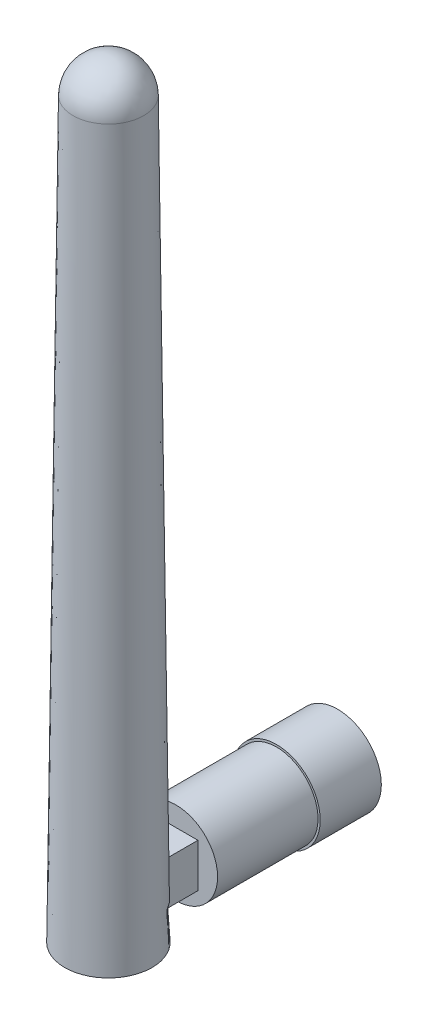
ISO-10303-21;
HEADER;
FILE_DESCRIPTION(('STEP AP214'),'2;1');
FILE_NAME('part.step','',(''),(''),'','','');
FILE_SCHEMA(('AUTOMOTIVE_DESIGN { 1 0 10303 214 1 1 1 1 }'));
ENDSEC;
DATA;
#1=APPLICATION_CONTEXT('core data for automotive mechanical design processes');
#2=APPLICATION_PROTOCOL_DEFINITION('international standard','automotive_design',2000,#1);
#3=PRODUCT_CONTEXT('',#1,'mechanical');
#4=PRODUCT('Part','Part','',(#3));
#5=PRODUCT_RELATED_PRODUCT_CATEGORY('part','',(#4));
#6=PRODUCT_DEFINITION_FORMATION('','',#4);
#7=PRODUCT_DEFINITION_CONTEXT('part definition',#1,'design');
#8=PRODUCT_DEFINITION('design','',#6,#7);
#9=PRODUCT_DEFINITION_SHAPE('','',#8);
#10=(LENGTH_UNIT() NAMED_UNIT(*) SI_UNIT(.MILLI.,.METRE.));
#11=(NAMED_UNIT(*) PLANE_ANGLE_UNIT() SI_UNIT($,.RADIAN.));
#12=(NAMED_UNIT(*) SI_UNIT($,.STERADIAN.) SOLID_ANGLE_UNIT());
#13=UNCERTAINTY_MEASURE_WITH_UNIT(LENGTH_MEASURE(1.E-05),#10,'distance_accuracy_value','');
#14=(GEOMETRIC_REPRESENTATION_CONTEXT(3) GLOBAL_UNCERTAINTY_ASSIGNED_CONTEXT((#13)) GLOBAL_UNIT_ASSIGNED_CONTEXT((#10,
#11,#12)) REPRESENTATION_CONTEXT('',''));
#15=CARTESIAN_POINT('',(0.,0.,0.));
#16=DIRECTION('',(0.,0.,1.));
#17=DIRECTION('',(1.,0.,0.));
#18=AXIS2_PLACEMENT_3D('',#15,#16,#17);
#19=CARTESIAN_POINT('',(-2.5,-2.5,29.));
#20=DIRECTION('',(1.,0.,0.));
#21=DIRECTION('',(0.,0.,-1.));
#22=AXIS2_PLACEMENT_3D('',#19,#20,#21);
#23=PLANE('',#22);
#24=CARTESIAN_POINT('',(-2.5,11.7231333728484,22.1407716701814));
#25=CARTESIAN_POINT('',(-2.5,8.55279811187691,22.0986135463618));
#26=CARTESIAN_POINT('',(-2.5,5.38246076507635,22.0566136043882));
#27=CARTESIAN_POINT('',(-2.5,-2.43295909163195,21.9534666291546));
#28=CARTESIAN_POINT('',(-2.5,-7.07804399339697,21.8925009858276));
#29=CARTESIAN_POINT('',(-2.5,-11.7231333728484,21.8318749142798));
#30=B_SPLINE_CURVE_WITH_KNOTS('',3,(#24,#25,#26,#27,#28,#29),.UNSPECIFIED.,.F.,.F.,(4,2,4),(0.,
9.51184661297679,23.4483015061139),.UNSPECIFIED.);
#31=CARTESIAN_POINT('',(-2.5,2.50000000000003,22.0185710497848));
#32=VERTEX_POINT('',#31);
#33=CARTESIAN_POINT('',(-2.5,-2.5,21.9527082752802));
#34=VERTEX_POINT('',#33);
#35=EDGE_CURVE('E174',#32,#34,#30,.T.);
#36=ORIENTED_EDGE('',*,*,#35,.F.);
#37=DIRECTION('',(0.,0.,-1.));
#38=VECTOR('',#37,1.);
#39=CARTESIAN_POINT('',(-2.5,2.5,29.));
#40=LINE('',#39,#38);
#41=CARTESIAN_POINT('',(-2.5,2.5,18.5));
#42=VERTEX_POINT('',#41);
#43=EDGE_CURVE('E200',#32,#42,#40,.T.);
#44=ORIENTED_EDGE('',*,*,#43,.T.);
#45=DIRECTION('',(0.,-1.,0.));
#46=VECTOR('',#45,1.);
#47=CARTESIAN_POINT('',(-2.5,-2.5,18.5));
#48=LINE('',#47,#46);
#49=CARTESIAN_POINT('',(-2.5,-2.5,18.5));
#50=VERTEX_POINT('',#49);
#51=EDGE_CURVE('E182',#42,#50,#48,.T.);
#52=ORIENTED_EDGE('',*,*,#51,.T.);
#53=DIRECTION('',(0.,0.,-1.));
#54=VECTOR('',#53,1.);
#55=CARTESIAN_POINT('',(-2.5,-2.5,29.));
#56=LINE('',#55,#54);
#57=EDGE_CURVE('E206',#34,#50,#56,.T.);
#58=ORIENTED_EDGE('',*,*,#57,.F.);
#59=EDGE_LOOP('',(#36,#44,#52,#58));
#60=FACE_BOUND('',#59,.T.);
#61=ADVANCED_FACE('F39',(#60),#23,.F.);
#62=CARTESIAN_POINT('',(2.5,-2.5,29.));
#63=DIRECTION('',(-1.,0.,0.));
#64=DIRECTION('',(0.,0.,1.));
#65=AXIS2_PLACEMENT_3D('',#62,#63,#64);
#66=PLANE('',#65);
#67=CARTESIAN_POINT('',(2.5,-11.7231333728484,21.8318749142797));
#68=CARTESIAN_POINT('',(2.5,-8.37717526376025,21.8755501126024));
#69=CARTESIAN_POINT('',(2.5,-5.03121944660668,21.9193993916369));
#70=CARTESIAN_POINT('',(2.5,2.78420459956527,22.0222284422381));
#71=CARTESIAN_POINT('',(2.5,7.25367103097728,22.0813447485042));
#72=CARTESIAN_POINT('',(2.5,11.7231333728484,22.1407716701814));
#73=B_SPLINE_CURVE_WITH_KNOTS('',3,(#67,#68,#69,#70,#71,#72),.UNSPECIFIED.,.F.,.F.,(4,2,4),(0.,
10.0387293920367,23.4483015057422),.UNSPECIFIED.);
#74=CARTESIAN_POINT('',(2.5,-2.5,21.95270827528));
#75=VERTEX_POINT('',#74);
#76=CARTESIAN_POINT('',(2.5,2.50000000000003,22.0185710497851));
#77=VERTEX_POINT('',#76);
#78=EDGE_CURVE('E183',#75,#77,#73,.T.);
#79=ORIENTED_EDGE('',*,*,#78,.F.);
#80=DIRECTION('',(0.,0.,-1.));
#81=VECTOR('',#80,1.);
#82=CARTESIAN_POINT('',(2.5,-2.5,29.));
#83=LINE('',#82,#81);
#84=CARTESIAN_POINT('',(2.5,-2.5,18.5));
#85=VERTEX_POINT('',#84);
#86=EDGE_CURVE('E204',#75,#85,#83,.T.);
#87=ORIENTED_EDGE('',*,*,#86,.T.);
#88=DIRECTION('',(0.,1.,0.));
#89=VECTOR('',#88,1.);
#90=CARTESIAN_POINT('',(2.5,-2.5,18.5));
#91=LINE('',#90,#89);
#92=CARTESIAN_POINT('',(2.5,2.5,18.5));
#93=VERTEX_POINT('',#92);
#94=EDGE_CURVE('E194',#85,#93,#91,.T.);
#95=ORIENTED_EDGE('',*,*,#94,.T.);
#96=DIRECTION('',(0.,0.,-1.));
#97=VECTOR('',#96,1.);
#98=CARTESIAN_POINT('',(2.5,2.5,29.));
#99=LINE('',#98,#97);
#100=EDGE_CURVE('E202',#77,#93,#99,.T.);
#101=ORIENTED_EDGE('',*,*,#100,.F.);
#102=EDGE_LOOP('',(#79,#87,#95,#101));
#103=FACE_BOUND('',#102,.T.);
#104=ADVANCED_FACE('F158',(#103),#66,.F.);
#105=CARTESIAN_POINT('',(0.,0.,7.));
#106=DIRECTION('',(0.,0.,-1.));
#107=DIRECTION('',(-1.,0.,0.));
#108=AXIS2_PLACEMENT_3D('',#105,#106,#107);
#109=CYLINDRICAL_SURFACE('',#108,5.);
#110=CARTESIAN_POINT('',(0.,0.,7.));
#111=DIRECTION('',(0.,0.,1.));
#112=DIRECTION('',(1.,0.,0.));
#113=AXIS2_PLACEMENT_3D('',#110,#111,#112);
#114=CIRCLE('',#113,5.);
#115=CARTESIAN_POINT('',(5.,0.,7.));
#116=VERTEX_POINT('',#115);
#117=EDGE_CURVE('E215',#116,#116,#114,.T.);
#118=ORIENTED_EDGE('',*,*,#117,.F.);
#119=EDGE_LOOP('',(#118));
#120=FACE_BOUND('',#119,.T.);
#121=CARTESIAN_POINT('',(0.,0.,0.));
#122=DIRECTION('',(0.,0.,1.));
#123=DIRECTION('',(1.,0.,0.));
#124=AXIS2_PLACEMENT_3D('',#121,#122,#123);
#125=CIRCLE('',#124,5.);
#126=CARTESIAN_POINT('',(5.,0.,0.));
#127=VERTEX_POINT('',#126);
#128=EDGE_CURVE('E211',#127,#127,#125,.T.);
#129=ORIENTED_EDGE('',*,*,#128,.T.);
#130=EDGE_LOOP('',(#129));
#131=FACE_BOUND('',#130,.T.);
#132=ADVANCED_FACE('F41',(#120,#131),#109,.T.);
#133=CARTESIAN_POINT('',(0.,0.,7.));
#134=DIRECTION('',(0.,0.,1.));
#135=DIRECTION('',(1.,0.,0.));
#136=AXIS2_PLACEMENT_3D('',#133,#134,#135);
#137=PLANE('',#136);
#138=CARTESIAN_POINT('',(0.,0.,7.));
#139=DIRECTION('',(0.,0.,1.));
#140=DIRECTION('',(1.,0.,0.));
#141=AXIS2_PLACEMENT_3D('',#138,#139,#140);
#142=CIRCLE('',#141,4.75);
#143=CARTESIAN_POINT('',(4.75,0.,7.));
#144=VERTEX_POINT('',#143);
#145=EDGE_CURVE('E212',#144,#144,#142,.T.);
#146=ORIENTED_EDGE('',*,*,#145,.F.);
#147=EDGE_LOOP('',(#146));
#148=FACE_BOUND('',#147,.T.);
#149=ORIENTED_EDGE('',*,*,#117,.T.);
#150=EDGE_LOOP('',(#149));
#151=FACE_BOUND('',#150,.T.);
#152=ADVANCED_FACE('F256',(#148,#151),#137,.T.);
#153=CARTESIAN_POINT('',(0.,0.,0.));
#154=DIRECTION('',(0.,0.,1.));
#155=DIRECTION('',(1.,0.,0.));
#156=AXIS2_PLACEMENT_3D('',#153,#154,#155);
#157=PLANE('',#156);
#158=ORIENTED_EDGE('',*,*,#128,.F.);
#159=EDGE_LOOP('',(#158));
#160=FACE_BOUND('',#159,.T.);
#161=ADVANCED_FACE('F251',(#160),#157,.F.);
#162=CARTESIAN_POINT('',(0.,0.,18.5));
#163=DIRECTION('',(0.,0.,-1.));
#164=DIRECTION('',(-1.,0.,0.));
#165=AXIS2_PLACEMENT_3D('',#162,#163,#164);
#166=CYLINDRICAL_SURFACE('',#165,4.75);
#167=CARTESIAN_POINT('',(0.,0.,18.5));
#168=DIRECTION('',(0.,0.,1.));
#169=DIRECTION('',(1.,0.,0.));
#170=AXIS2_PLACEMENT_3D('',#167,#168,#169);
#171=CIRCLE('',#170,4.75);
#172=CARTESIAN_POINT('',(4.75,0.,18.5));
#173=VERTEX_POINT('',#172);
#174=EDGE_CURVE('E208',#173,#173,#171,.T.);
#175=ORIENTED_EDGE('',*,*,#174,.F.);
#176=EDGE_LOOP('',(#175));
#177=FACE_BOUND('',#176,.T.);
#178=ORIENTED_EDGE('',*,*,#145,.T.);
#179=EDGE_LOOP('',(#178));
#180=FACE_BOUND('',#179,.T.);
#181=ADVANCED_FACE('F247',(#177,#180),#166,.T.);
#182=CARTESIAN_POINT('',(0.,0.,18.5));
#183=DIRECTION('',(0.,0.,1.));
#184=DIRECTION('',(1.,0.,0.));
#185=AXIS2_PLACEMENT_3D('',#182,#183,#184);
#186=PLANE('',#185);
#187=ORIENTED_EDGE('',*,*,#94,.F.);
#188=DIRECTION('',(1.,0.,0.));
#189=VECTOR('',#188,1.);
#190=CARTESIAN_POINT('',(-2.5,-2.5,18.5));
#191=LINE('',#190,#189);
#192=EDGE_CURVE('E191',#50,#85,#191,.T.);
#193=ORIENTED_EDGE('',*,*,#192,.F.);
#194=ORIENTED_EDGE('',*,*,#51,.F.);
#195=DIRECTION('',(-1.,0.,0.));
#196=VECTOR('',#195,1.);
#197=CARTESIAN_POINT('',(-2.5,2.5,18.5));
#198=LINE('',#197,#196);
#199=EDGE_CURVE('E197',#93,#42,#198,.T.);
#200=ORIENTED_EDGE('',*,*,#199,.F.);
#201=EDGE_LOOP('',(#187,#193,#194,#200));
#202=FACE_BOUND('',#201,.T.);
#203=ORIENTED_EDGE('',*,*,#174,.T.);
#204=EDGE_LOOP('',(#203));
#205=FACE_BOUND('',#204,.T.);
#206=ADVANCED_FACE('F171',(#202,#205),#186,.T.);
#207=CARTESIAN_POINT('',(-2.5,-2.5,29.));
#208=DIRECTION('',(0.,1.,0.));
#209=DIRECTION('',(0.,0.,1.));
#210=AXIS2_PLACEMENT_3D('',#207,#208,#209);
#211=PLANE('',#210);
#212=ORIENTED_EDGE('',*,*,#86,.F.);
#213=DIRECTION('',(0.,0.,1.));
#214=VECTOR('',#213,1.);
#215=CARTESIAN_POINT('',(2.5,-2.5,18.5));
#216=LINE('',#215,#214);
#217=CARTESIAN_POINT('',(2.5,-2.5,29.));
#218=VERTEX_POINT('',#217);
#219=EDGE_CURVE('E109',#75,#218,#216,.T.);
#220=ORIENTED_EDGE('',*,*,#219,.T.);
#221=DIRECTION('',(-1.,0.,0.));
#222=VECTOR('',#221,1.);
#223=CARTESIAN_POINT('',(-2.50000000000004,-2.5,29.));
#224=LINE('',#223,#222);
#225=CARTESIAN_POINT('',(-2.50000000000004,-2.5,29.));
#226=VERTEX_POINT('',#225);
#227=EDGE_CURVE('E108',#218,#226,#224,.T.);
#228=ORIENTED_EDGE('',*,*,#227,.T.);
#229=DIRECTION('',(0.,0.,-1.));
#230=VECTOR('',#229,1.);
#231=CARTESIAN_POINT('',(-2.5,-2.5,18.5));
#232=LINE('',#231,#230);
#233=EDGE_CURVE('E118',#226,#34,#232,.T.);
#234=ORIENTED_EDGE('',*,*,#233,.T.);
#235=ORIENTED_EDGE('',*,*,#57,.T.);
#236=ORIENTED_EDGE('',*,*,#192,.T.);
#237=EDGE_LOOP('',(#212,#220,#228,#234,#235,#236));
#238=FACE_BOUND('',#237,.T.);
#239=ADVANCED_FACE('F170',(#238),#211,.F.);
#240=CARTESIAN_POINT('',(-2.5,2.5,29.));
#241=DIRECTION('',(0.,-1.,0.));
#242=DIRECTION('',(0.,0.,-1.));
#243=AXIS2_PLACEMENT_3D('',#240,#241,#242);
#244=PLANE('',#243);
#245=CARTESIAN_POINT('',(-2.70990556737046E-13,2.50000000000003,26.2499999999997));
#246=DIRECTION('',(0.,-1.,0.));
#247=DIRECTION('',(0.,0.,-1.));
#248=AXIS2_PLACEMENT_3D('',#245,#246,#247);
#249=CIRCLE('',#248,4.91477272726987);
#250=EDGE_CURVE('E47',#77,#32,#249,.F.);
#251=ORIENTED_EDGE('',*,*,#250,.F.);
#252=ORIENTED_EDGE('',*,*,#100,.T.);
#253=ORIENTED_EDGE('',*,*,#199,.T.);
#254=ORIENTED_EDGE('',*,*,#43,.F.);
#255=EDGE_LOOP('',(#251,#252,#253,#254));
#256=FACE_BOUND('',#255,.T.);
#257=ADVANCED_FACE('F236',(#256),#244,.F.);
#258=CARTESIAN_POINT('',(-2.70990556737046E-13,79.000258239291,26.25));
#259=DIRECTION('',(0.,-1.,0.));
#260=DIRECTION('',(1.,0.,0.));
#261=AXIS2_PLACEMENT_3D('',#258,#259,#260);
#262=CONICAL_SURFACE('',#261,4.04545161088495,0.0113631472646742);
#263=CARTESIAN_POINT('',(-2.70990556737046E-13,79.000258239291,26.25));
#264=DIRECTION('',(0.,-1.,0.));
#265=DIRECTION('',(1.,0.,0.));
#266=AXIS2_PLACEMENT_3D('',#263,#264,#265);
#267=CIRCLE('',#266,4.04545161088495);
#268=CARTESIAN_POINT('',(4.04545161088468,79.000258239291,26.25));
#269=VERTEX_POINT('',#268);
#270=EDGE_CURVE('E223',#269,#269,#267,.T.);
#271=ORIENTED_EDGE('',*,*,#270,.T.);
#272=EDGE_LOOP('',(#271));
#273=FACE_BOUND('',#272,.T.);
#274=CARTESIAN_POINT('',(0.,-5.,26.25));
#275=DIRECTION('',(0.,-1.,0.));
#276=DIRECTION('',(1.,0.,0.));
#277=AXIS2_PLACEMENT_3D('',#274,#275,#276);
#278=CIRCLE('',#277,5.00000000000002);
#279=CARTESIAN_POINT('',(2.50000000000001,-4.99999999999998,21.9198729810778));
#280=VERTEX_POINT('',#279);
#281=CARTESIAN_POINT('',(-2.49999999999999,-5.,21.9198729810778));
#282=VERTEX_POINT('',#281);
#283=EDGE_CURVE('E225',#280,#282,#278,.T.);
#284=ORIENTED_EDGE('',*,*,#283,.F.);
#285=CARTESIAN_POINT('',(2.50000000000004,-13.1434487374512,21.8133396114039));
#286=CARTESIAN_POINT('',(2.50000000000003,-9.78685192034685,21.8571120582125));
#287=CARTESIAN_POINT('',(2.50000000000001,-6.43025734198439,21.9010548959516));
#288=CARTESIAN_POINT('',(2.49999999999999,-0.167958744741171,21.9833556885611));
#289=CARTESIAN_POINT('',(2.49999999999998,2.73774583519715,22.0216709412681));
#290=CARTESIAN_POINT('',(2.49999999999997,5.64344873745118,22.0601138827423));
#291=B_SPLINE_CURVE_WITH_KNOTS('',3,(#285,#286,#287,#288,#289,#290),.UNSPECIFIED.,.F.,.F.,(4,2,
4),(0.,10.0706466142114,18.7885181709723),.UNSPECIFIED.);
#292=EDGE_CURVE('E101',#280,#75,#291,.T.);
#293=ORIENTED_EDGE('',*,*,#292,.T.);
#294=ORIENTED_EDGE('',*,*,#78,.T.);
#295=ORIENTED_EDGE('',*,*,#250,.T.);
#296=ORIENTED_EDGE('',*,*,#35,.T.);
#297=CARTESIAN_POINT('',(-2.50000000000003,5.64344873745118,22.0601138827423));
#298=CARTESIAN_POINT('',(-2.50000000000002,2.42757387248372,22.017568176168));
#299=CARTESIAN_POINT('',(-2.50000000000001,-0.788303040907223,21.975178431017));
#300=CARTESIAN_POINT('',(-2.49999999999998,-7.05060240940073,21.8929363440764));
#301=CARTESIAN_POINT('',(-2.49999999999997,-10.0970246543106,21.8530679987814));
#302=CARTESIAN_POINT('',(-2.49999999999996,-13.1434487374512,21.8133396114039));
#303=B_SPLINE_CURVE_WITH_KNOTS('',3,(#297,#298,#299,#300,#301,#302),.UNSPECIFIED.,.F.,.F.,(4,2,
4),(0.,9.64846883775729,18.788518170947),.UNSPECIFIED.);
#304=EDGE_CURVE('E121',#34,#282,#303,.T.);
#305=ORIENTED_EDGE('',*,*,#304,.T.);
#306=EDGE_LOOP('',(#284,#293,#294,#295,#296,#305));
#307=FACE_BOUND('',#306,.T.);
#308=ADVANCED_FACE('F139',(#273,#307),#262,.T.);
#309=CARTESIAN_POINT('',(-2.70833702686879E-13,78.9542871984199,26.25));
#310=DIRECTION('',(0.,-1.,0.));
#311=DIRECTION('',(1.,0.,0.));
#312=AXIS2_PLACEMENT_3D('',#309,#310,#311);
#313=SPHERICAL_SURFACE('',#312,4.0457128015637);
#314=ORIENTED_EDGE('',*,*,#270,.F.);
#315=EDGE_LOOP('',(#314));
#316=FACE_BOUND('',#315,.T.);
#317=ADVANCED_FACE('F152',(#316),#313,.T.);
#318=CARTESIAN_POINT('',(0.,-4.99999999999999,26.25));
#319=DIRECTION('',(0.,1.,0.));
#320=DIRECTION('',(-1.,0.,0.));
#321=AXIS2_PLACEMENT_3D('',#318,#319,#320);
#322=PLANE('',#321);
#323=DIRECTION('',(-1.,0.,0.));
#324=VECTOR('',#323,1.);
#325=CARTESIAN_POINT('',(-2.49999999999999,-5.,29.));
#326=LINE('',#325,#324);
#327=CARTESIAN_POINT('',(2.50000000000001,-4.99999999999998,29.));
#328=VERTEX_POINT('',#327);
#329=CARTESIAN_POINT('',(-2.49999999999999,-5.,29.));
#330=VERTEX_POINT('',#329);
#331=EDGE_CURVE('E54',#328,#330,#326,.T.);
#332=ORIENTED_EDGE('',*,*,#331,.F.);
#333=DIRECTION('',(0.,0.,-1.));
#334=VECTOR('',#333,1.);
#335=CARTESIAN_POINT('',(2.50000000000001,-4.99999999999998,26.25));
#336=LINE('',#335,#334);
#337=EDGE_CURVE('E11',#328,#280,#336,.T.);
#338=ORIENTED_EDGE('',*,*,#337,.T.);
#339=ORIENTED_EDGE('',*,*,#283,.T.);
#340=DIRECTION('',(0.,0.,-1.));
#341=VECTOR('',#340,1.);
#342=CARTESIAN_POINT('',(-2.49999999999999,-5.,18.5));
#343=LINE('',#342,#341);
#344=EDGE_CURVE('E113',#330,#282,#343,.T.);
#345=ORIENTED_EDGE('',*,*,#344,.F.);
#346=EDGE_LOOP('',(#332,#338,#339,#345));
#347=FACE_BOUND('',#346,.T.);
#348=ADVANCED_FACE('F112',(#347),#322,.F.);
#349=CARTESIAN_POINT('',(2.49999999999996,9.12970334961302,18.5));
#350=DIRECTION('',(1.,0.,0.));
#351=DIRECTION('',(0.,1.,0.));
#352=AXIS2_PLACEMENT_3D('',#349,#350,#351);
#353=PLANE('',#352);
#354=ORIENTED_EDGE('',*,*,#337,.F.);
#355=DIRECTION('',(0.,-1.,0.));
#356=VECTOR('',#355,1.);
#357=CARTESIAN_POINT('',(2.49999999999996,9.12970334961302,29.));
#358=LINE('',#357,#356);
#359=EDGE_CURVE('E99',#218,#328,#358,.T.);
#360=ORIENTED_EDGE('',*,*,#359,.F.);
#361=ORIENTED_EDGE('',*,*,#219,.F.);
#362=ORIENTED_EDGE('',*,*,#292,.F.);
#363=EDGE_LOOP('',(#354,#360,#361,#362));
#364=FACE_BOUND('',#363,.T.);
#365=ADVANCED_FACE('F98',(#364),#353,.F.);
#366=CARTESIAN_POINT('',(-2.50000000000004,9.129703349613,18.5));
#367=DIRECTION('',(-1.,0.,0.));
#368=DIRECTION('',(0.,-1.,0.));
#369=AXIS2_PLACEMENT_3D('',#366,#367,#368);
#370=PLANE('',#369);
#371=ORIENTED_EDGE('',*,*,#233,.F.);
#372=DIRECTION('',(0.,-1.,0.));
#373=VECTOR('',#372,1.);
#374=CARTESIAN_POINT('',(-2.50000000000004,9.129703349613,29.));
#375=LINE('',#374,#373);
#376=EDGE_CURVE('E122',#226,#330,#375,.T.);
#377=ORIENTED_EDGE('',*,*,#376,.T.);
#378=ORIENTED_EDGE('',*,*,#344,.T.);
#379=ORIENTED_EDGE('',*,*,#304,.F.);
#380=EDGE_LOOP('',(#371,#377,#378,#379));
#381=FACE_BOUND('',#380,.T.);
#382=ADVANCED_FACE('F143',(#381),#370,.F.);
#383=CARTESIAN_POINT('',(-2.50000000000004,9.129703349613,29.));
#384=DIRECTION('',(0.,0.,1.));
#385=DIRECTION('',(1.,0.,0.));
#386=AXIS2_PLACEMENT_3D('',#383,#384,#385);
#387=PLANE('',#386);
#388=ORIENTED_EDGE('',*,*,#359,.T.);
#389=ORIENTED_EDGE('',*,*,#331,.T.);
#390=ORIENTED_EDGE('',*,*,#376,.F.);
#391=ORIENTED_EDGE('',*,*,#227,.F.);
#392=EDGE_LOOP('',(#388,#389,#390,#391));
#393=FACE_BOUND('',#392,.T.);
#394=ADVANCED_FACE('F106',(#393),#387,.F.);
#395=CLOSED_SHELL('',(#61,#104,#132,#152,#161,#181,#206,#239,#257,#308,#317,#348,#365,#382,#394));
#396=MANIFOLD_SOLID_BREP('B2',#395);
#397=ADVANCED_BREP_SHAPE_REPRESENTATION('',(#18,#396),#14);
#398=SHAPE_DEFINITION_REPRESENTATION(#9,#397);
ENDSEC;
END-ISO-10303-21;
